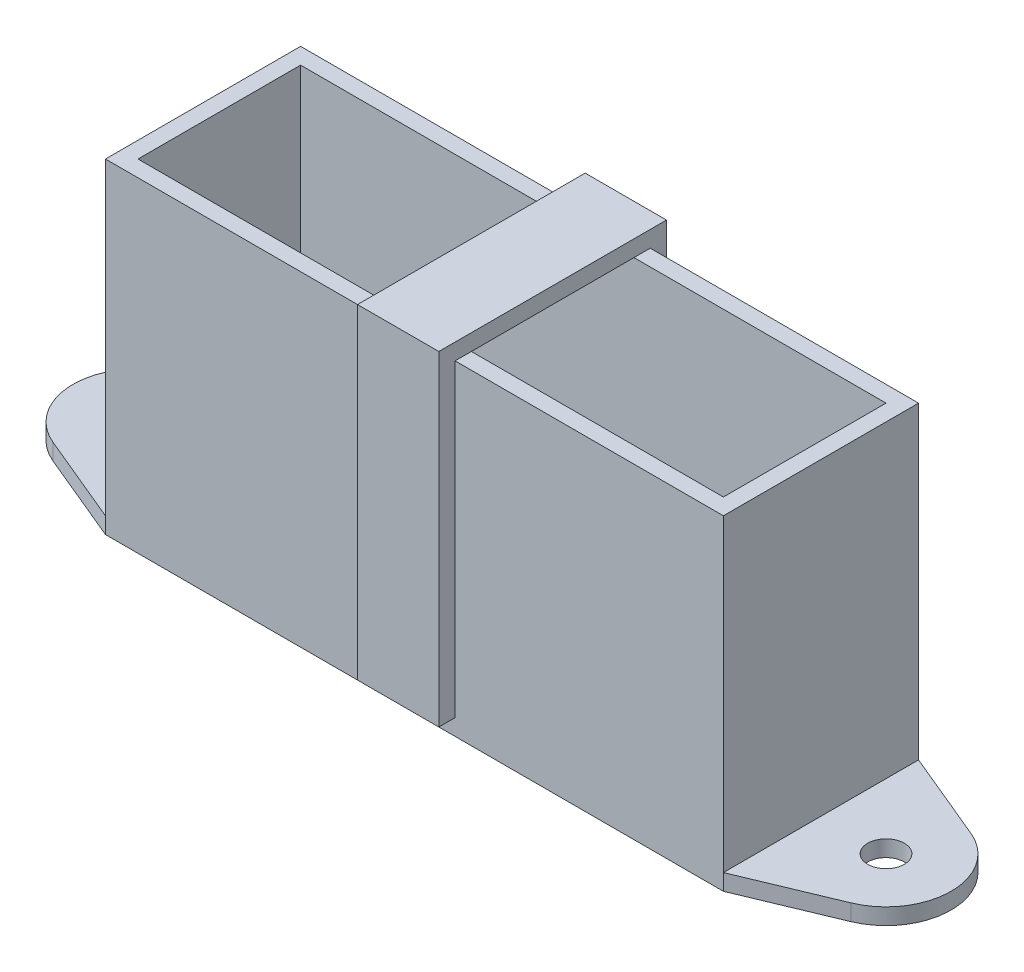
ISO-10303-21;
HEADER;
FILE_DESCRIPTION(('STEP AP214'),'2;1');
FILE_NAME('part.step','',(''),(''),'','','');
FILE_SCHEMA(('AUTOMOTIVE_DESIGN { 1 0 10303 214 1 1 1 1 }'));
ENDSEC;
DATA;
#1=APPLICATION_CONTEXT('core data for automotive mechanical design processes');
#2=APPLICATION_PROTOCOL_DEFINITION('international standard','automotive_design',2000,#1);
#3=PRODUCT_CONTEXT('',#1,'mechanical');
#4=PRODUCT('Part','Part','',(#3));
#5=PRODUCT_RELATED_PRODUCT_CATEGORY('part','',(#4));
#6=PRODUCT_DEFINITION_FORMATION('','',#4);
#7=PRODUCT_DEFINITION_CONTEXT('part definition',#1,'design');
#8=PRODUCT_DEFINITION('design','',#6,#7);
#9=PRODUCT_DEFINITION_SHAPE('','',#8);
#10=(LENGTH_UNIT() NAMED_UNIT(*) SI_UNIT(.MILLI.,.METRE.));
#11=(NAMED_UNIT(*) PLANE_ANGLE_UNIT() SI_UNIT($,.RADIAN.));
#12=(NAMED_UNIT(*) SI_UNIT($,.STERADIAN.) SOLID_ANGLE_UNIT());
#13=UNCERTAINTY_MEASURE_WITH_UNIT(LENGTH_MEASURE(1.E-05),#10,'distance_accuracy_value','');
#14=(GEOMETRIC_REPRESENTATION_CONTEXT(3) GLOBAL_UNCERTAINTY_ASSIGNED_CONTEXT((#13)) GLOBAL_UNIT_ASSIGNED_CONTEXT((#10,
#11,#12)) REPRESENTATION_CONTEXT('',''));
#15=CARTESIAN_POINT('',(0.,0.,0.));
#16=DIRECTION('',(0.,0.,1.));
#17=DIRECTION('',(1.,0.,0.));
#18=AXIS2_PLACEMENT_3D('',#15,#16,#17);
#19=CARTESIAN_POINT('',(-5.,40.,-12.));
#20=DIRECTION('',(1.,0.,0.));
#21=DIRECTION('',(0.,0.,-1.));
#22=AXIS2_PLACEMENT_3D('',#19,#20,#21);
#23=PLANE('',#22);
#24=DIRECTION('',(0.,0.,1.));
#25=VECTOR('',#24,1.);
#26=CARTESIAN_POINT('',(-5.,38.,-12.));
#27=LINE('',#26,#25);
#28=CARTESIAN_POINT('',(-5.,38.,-12.));
#29=VERTEX_POINT('',#28);
#30=CARTESIAN_POINT('',(-5.,38.,12.));
#31=VERTEX_POINT('',#30);
#32=EDGE_CURVE('E173',#29,#31,#27,.T.);
#33=ORIENTED_EDGE('',*,*,#32,.T.);
#34=DIRECTION('',(0.,-1.,0.));
#35=VECTOR('',#34,1.);
#36=CARTESIAN_POINT('',(-5.,40.,12.));
#37=LINE('',#36,#35);
#38=CARTESIAN_POINT('',(-5.,0.,12.));
#39=VERTEX_POINT('',#38);
#40=EDGE_CURVE('E154',#31,#39,#37,.T.);
#41=ORIENTED_EDGE('',*,*,#40,.T.);
#42=DIRECTION('',(0.,0.,-1.));
#43=VECTOR('',#42,1.);
#44=CARTESIAN_POINT('',(-5.,0.,14.));
#45=LINE('',#44,#43);
#46=CARTESIAN_POINT('',(-5.,0.,14.));
#47=VERTEX_POINT('',#46);
#48=EDGE_CURVE('E171',#47,#39,#45,.T.);
#49=ORIENTED_EDGE('',*,*,#48,.F.);
#50=DIRECTION('',(0.,-1.,0.));
#51=VECTOR('',#50,1.);
#52=CARTESIAN_POINT('',(-5.,40.,14.));
#53=LINE('',#52,#51);
#54=CARTESIAN_POINT('',(-5.,40.,14.));
#55=VERTEX_POINT('',#54);
#56=EDGE_CURVE('E121',#55,#47,#53,.T.);
#57=ORIENTED_EDGE('',*,*,#56,.F.);
#58=DIRECTION('',(0.,0.,1.));
#59=VECTOR('',#58,1.);
#60=CARTESIAN_POINT('',(-5.,40.,-12.));
#61=LINE('',#60,#59);
#62=CARTESIAN_POINT('',(-5.,40.,-14.));
#63=VERTEX_POINT('',#62);
#64=EDGE_CURVE('E57',#63,#55,#61,.T.);
#65=ORIENTED_EDGE('',*,*,#64,.F.);
#66=DIRECTION('',(0.,-1.,0.));
#67=VECTOR('',#66,1.);
#68=CARTESIAN_POINT('',(-5.,40.,-14.));
#69=LINE('',#68,#67);
#70=CARTESIAN_POINT('',(-5.,0.,-14.));
#71=VERTEX_POINT('',#70);
#72=EDGE_CURVE('E117',#63,#71,#69,.T.);
#73=ORIENTED_EDGE('',*,*,#72,.T.);
#74=DIRECTION('',(0.,0.,1.));
#75=VECTOR('',#74,1.);
#76=CARTESIAN_POINT('',(-5.,0.,-14.));
#77=LINE('',#76,#75);
#78=CARTESIAN_POINT('',(-5.,0.,-12.));
#79=VERTEX_POINT('',#78);
#80=EDGE_CURVE('E143',#71,#79,#77,.T.);
#81=ORIENTED_EDGE('',*,*,#80,.T.);
#82=DIRECTION('',(0.,-1.,0.));
#83=VECTOR('',#82,1.);
#84=CARTESIAN_POINT('',(-5.,40.,-12.));
#85=LINE('',#84,#83);
#86=EDGE_CURVE('E144',#29,#79,#85,.T.);
#87=ORIENTED_EDGE('',*,*,#86,.F.);
#88=EDGE_LOOP('',(#33,#41,#49,#57,#65,#73,#81,#87));
#89=FACE_BOUND('',#88,.T.);
#90=ADVANCED_FACE('F49',(#89),#23,.F.);
#91=CARTESIAN_POINT('',(5.,40.,-12.));
#92=DIRECTION('',(-1.,0.,0.));
#93=DIRECTION('',(0.,0.,1.));
#94=AXIS2_PLACEMENT_3D('',#91,#92,#93);
#95=PLANE('',#94);
#96=DIRECTION('',(0.,0.,-1.));
#97=VECTOR('',#96,1.);
#98=CARTESIAN_POINT('',(5.,38.,-12.));
#99=LINE('',#98,#97);
#100=CARTESIAN_POINT('',(5.,38.,12.));
#101=VERTEX_POINT('',#100);
#102=CARTESIAN_POINT('',(5.,38.,-12.));
#103=VERTEX_POINT('',#102);
#104=EDGE_CURVE('E65',#101,#103,#99,.T.);
#105=ORIENTED_EDGE('',*,*,#104,.T.);
#106=DIRECTION('',(0.,1.,0.));
#107=VECTOR('',#106,1.);
#108=CARTESIAN_POINT('',(5.,40.,-12.));
#109=LINE('',#108,#107);
#110=CARTESIAN_POINT('',(5.,0.,-12.));
#111=VERTEX_POINT('',#110);
#112=EDGE_CURVE('E146',#111,#103,#109,.T.);
#113=ORIENTED_EDGE('',*,*,#112,.F.);
#114=DIRECTION('',(0.,0.,1.));
#115=VECTOR('',#114,1.);
#116=CARTESIAN_POINT('',(5.,0.,-14.));
#117=LINE('',#116,#115);
#118=CARTESIAN_POINT('',(5.,0.,-14.));
#119=VERTEX_POINT('',#118);
#120=EDGE_CURVE('E152',#119,#111,#117,.T.);
#121=ORIENTED_EDGE('',*,*,#120,.F.);
#122=DIRECTION('',(0.,1.,0.));
#123=VECTOR('',#122,1.);
#124=CARTESIAN_POINT('',(5.,40.,-14.));
#125=LINE('',#124,#123);
#126=CARTESIAN_POINT('',(5.,40.,-14.));
#127=VERTEX_POINT('',#126);
#128=EDGE_CURVE('E138',#119,#127,#125,.T.);
#129=ORIENTED_EDGE('',*,*,#128,.T.);
#130=DIRECTION('',(0.,0.,-1.));
#131=VECTOR('',#130,1.);
#132=CARTESIAN_POINT('',(5.,40.,-12.));
#133=LINE('',#132,#131);
#134=CARTESIAN_POINT('',(5.,40.,14.));
#135=VERTEX_POINT('',#134);
#136=EDGE_CURVE('E12',#135,#127,#133,.T.);
#137=ORIENTED_EDGE('',*,*,#136,.F.);
#138=DIRECTION('',(0.,1.,0.));
#139=VECTOR('',#138,1.);
#140=CARTESIAN_POINT('',(5.,40.,14.));
#141=LINE('',#140,#139);
#142=CARTESIAN_POINT('',(5.,0.,14.));
#143=VERTEX_POINT('',#142);
#144=EDGE_CURVE('E159',#143,#135,#141,.T.);
#145=ORIENTED_EDGE('',*,*,#144,.F.);
#146=DIRECTION('',(0.,0.,-1.));
#147=VECTOR('',#146,1.);
#148=CARTESIAN_POINT('',(5.,0.,14.));
#149=LINE('',#148,#147);
#150=CARTESIAN_POINT('',(5.,0.,12.));
#151=VERTEX_POINT('',#150);
#152=EDGE_CURVE('E164',#143,#151,#149,.T.);
#153=ORIENTED_EDGE('',*,*,#152,.T.);
#154=DIRECTION('',(0.,1.,0.));
#155=VECTOR('',#154,1.);
#156=CARTESIAN_POINT('',(5.,40.,12.));
#157=LINE('',#156,#155);
#158=EDGE_CURVE('E157',#151,#101,#157,.T.);
#159=ORIENTED_EDGE('',*,*,#158,.T.);
#160=EDGE_LOOP('',(#105,#113,#121,#129,#137,#145,#153,#159));
#161=FACE_BOUND('',#160,.T.);
#162=ADVANCED_FACE('F184',(#161),#95,.F.);
#163=CARTESIAN_POINT('',(0.,40.,0.));
#164=DIRECTION('',(0.,1.,0.));
#165=DIRECTION('',(0.,0.,1.));
#166=AXIS2_PLACEMENT_3D('',#163,#164,#165);
#167=PLANE('',#166);
#168=ORIENTED_EDGE('',*,*,#64,.T.);
#169=DIRECTION('',(-1.,0.,0.));
#170=VECTOR('',#169,1.);
#171=CARTESIAN_POINT('',(-5.,40.,14.));
#172=LINE('',#171,#170);
#173=EDGE_CURVE('E162',#135,#55,#172,.T.);
#174=ORIENTED_EDGE('',*,*,#173,.F.);
#175=ORIENTED_EDGE('',*,*,#136,.T.);
#176=DIRECTION('',(-1.,0.,0.));
#177=VECTOR('',#176,1.);
#178=CARTESIAN_POINT('',(-5.,40.,-14.));
#179=LINE('',#178,#177);
#180=EDGE_CURVE('E131',#127,#63,#179,.T.);
#181=ORIENTED_EDGE('',*,*,#180,.T.);
#182=EDGE_LOOP('',(#168,#174,#175,#181));
#183=FACE_BOUND('',#182,.T.);
#184=ADVANCED_FACE('F137',(#183),#167,.T.);
#185=CARTESIAN_POINT('',(0.,38.,0.));
#186=DIRECTION('',(0.,1.,0.));
#187=DIRECTION('',(0.,0.,1.));
#188=AXIS2_PLACEMENT_3D('',#185,#186,#187);
#189=PLANE('',#188);
#190=ORIENTED_EDGE('',*,*,#32,.F.);
#191=DIRECTION('',(-1.,0.,0.));
#192=VECTOR('',#191,1.);
#193=CARTESIAN_POINT('',(-5.,38.,-12.));
#194=LINE('',#193,#192);
#195=EDGE_CURVE('E52',#103,#29,#194,.T.);
#196=ORIENTED_EDGE('',*,*,#195,.F.);
#197=ORIENTED_EDGE('',*,*,#104,.F.);
#198=DIRECTION('',(1.,0.,0.));
#199=VECTOR('',#198,1.);
#200=CARTESIAN_POINT('',(-5.,38.,12.));
#201=LINE('',#200,#199);
#202=EDGE_CURVE('E72',#31,#101,#201,.T.);
#203=ORIENTED_EDGE('',*,*,#202,.F.);
#204=EDGE_LOOP('',(#190,#196,#197,#203));
#205=FACE_BOUND('',#204,.T.);
#206=ADVANCED_FACE('F190',(#205),#189,.F.);
#207=CARTESIAN_POINT('',(0.,0.,12.));
#208=DIRECTION('',(0.,0.,1.));
#209=DIRECTION('',(1.,0.,0.));
#210=AXIS2_PLACEMENT_3D('',#207,#208,#209);
#211=PLANE('',#210);
#212=ORIENTED_EDGE('',*,*,#40,.F.);
#213=ORIENTED_EDGE('',*,*,#202,.T.);
#214=ORIENTED_EDGE('',*,*,#158,.F.);
#215=DIRECTION('',(1.,0.,0.));
#216=VECTOR('',#215,1.);
#217=CARTESIAN_POINT('',(-5.,0.,12.));
#218=LINE('',#217,#216);
#219=EDGE_CURVE('E166',#39,#151,#218,.T.);
#220=ORIENTED_EDGE('',*,*,#219,.F.);
#221=EDGE_LOOP('',(#212,#213,#214,#220));
#222=FACE_BOUND('',#221,.T.);
#223=ADVANCED_FACE('F194',(#222),#211,.F.);
#224=CARTESIAN_POINT('',(-5.,0.,14.));
#225=DIRECTION('',(0.,1.,0.));
#226=DIRECTION('',(0.,0.,1.));
#227=AXIS2_PLACEMENT_3D('',#224,#225,#226);
#228=PLANE('',#227);
#229=ORIENTED_EDGE('',*,*,#219,.T.);
#230=ORIENTED_EDGE('',*,*,#152,.F.);
#231=DIRECTION('',(1.,0.,0.));
#232=VECTOR('',#231,1.);
#233=CARTESIAN_POINT('',(-5.,0.,14.));
#234=LINE('',#233,#232);
#235=EDGE_CURVE('E156',#47,#143,#234,.T.);
#236=ORIENTED_EDGE('',*,*,#235,.F.);
#237=ORIENTED_EDGE('',*,*,#48,.T.);
#238=EDGE_LOOP('',(#229,#230,#236,#237));
#239=FACE_BOUND('',#238,.T.);
#240=ADVANCED_FACE('F196',(#239),#228,.F.);
#241=CARTESIAN_POINT('',(0.,0.,14.));
#242=DIRECTION('',(0.,0.,1.));
#243=DIRECTION('',(1.,0.,0.));
#244=AXIS2_PLACEMENT_3D('',#241,#242,#243);
#245=PLANE('',#244);
#246=ORIENTED_EDGE('',*,*,#56,.T.);
#247=ORIENTED_EDGE('',*,*,#235,.T.);
#248=ORIENTED_EDGE('',*,*,#144,.T.);
#249=ORIENTED_EDGE('',*,*,#173,.T.);
#250=EDGE_LOOP('',(#246,#247,#248,#249));
#251=FACE_BOUND('',#250,.T.);
#252=ADVANCED_FACE('F199',(#251),#245,.T.);
#253=CARTESIAN_POINT('',(0.,0.,-12.));
#254=DIRECTION('',(0.,0.,-1.));
#255=DIRECTION('',(1.,0.,0.));
#256=AXIS2_PLACEMENT_3D('',#253,#254,#255);
#257=PLANE('',#256);
#258=ORIENTED_EDGE('',*,*,#112,.T.);
#259=ORIENTED_EDGE('',*,*,#195,.T.);
#260=ORIENTED_EDGE('',*,*,#86,.T.);
#261=DIRECTION('',(1.,0.,0.));
#262=VECTOR('',#261,1.);
#263=CARTESIAN_POINT('',(-5.,0.,-12.));
#264=LINE('',#263,#262);
#265=EDGE_CURVE('E135',#79,#111,#264,.T.);
#266=ORIENTED_EDGE('',*,*,#265,.T.);
#267=EDGE_LOOP('',(#258,#259,#260,#266));
#268=FACE_BOUND('',#267,.T.);
#269=ADVANCED_FACE('F179',(#268),#257,.F.);
#270=CARTESIAN_POINT('',(-5.,0.,-14.));
#271=DIRECTION('',(0.,-1.,0.));
#272=DIRECTION('',(0.,0.,-1.));
#273=AXIS2_PLACEMENT_3D('',#270,#271,#272);
#274=PLANE('',#273);
#275=ORIENTED_EDGE('',*,*,#265,.F.);
#276=ORIENTED_EDGE('',*,*,#80,.F.);
#277=DIRECTION('',(1.,0.,0.));
#278=VECTOR('',#277,1.);
#279=CARTESIAN_POINT('',(-5.,0.,-14.));
#280=LINE('',#279,#278);
#281=EDGE_CURVE('E134',#71,#119,#280,.T.);
#282=ORIENTED_EDGE('',*,*,#281,.T.);
#283=ORIENTED_EDGE('',*,*,#120,.T.);
#284=EDGE_LOOP('',(#275,#276,#282,#283));
#285=FACE_BOUND('',#284,.T.);
#286=ADVANCED_FACE('F183',(#285),#274,.T.);
#287=CARTESIAN_POINT('',(0.,0.,-14.));
#288=DIRECTION('',(0.,0.,-1.));
#289=DIRECTION('',(1.,0.,0.));
#290=AXIS2_PLACEMENT_3D('',#287,#288,#289);
#291=PLANE('',#290);
#292=ORIENTED_EDGE('',*,*,#72,.F.);
#293=ORIENTED_EDGE('',*,*,#180,.F.);
#294=ORIENTED_EDGE('',*,*,#128,.F.);
#295=ORIENTED_EDGE('',*,*,#281,.F.);
#296=EDGE_LOOP('',(#292,#293,#294,#295));
#297=FACE_BOUND('',#296,.T.);
#298=ADVANCED_FACE('F129',(#297),#291,.T.);
#299=CLOSED_SHELL('',(#90,#162,#184,#206,#223,#240,#252,#269,#286,#298));
#300=MANIFOLD_SOLID_BREP('B2',#299);
#301=CARTESIAN_POINT('',(0.,38.,0.));
#302=DIRECTION('',(0.,1.,0.));
#303=DIRECTION('',(0.,0.,1.));
#304=AXIS2_PLACEMENT_3D('',#301,#302,#303);
#305=PLANE('',#304);
#306=DIRECTION('',(1.,0.,0.));
#307=VECTOR('',#306,1.);
#308=CARTESIAN_POINT('',(-38.,38.,12.));
#309=LINE('',#308,#307);
#310=CARTESIAN_POINT('',(-38.,38.,12.));
#311=VERTEX_POINT('',#310);
#312=CARTESIAN_POINT('',(38.,38.,12.));
#313=VERTEX_POINT('',#312);
#314=EDGE_CURVE('E383',#311,#313,#309,.T.);
#315=ORIENTED_EDGE('',*,*,#314,.T.);
#316=DIRECTION('',(0.,0.,-1.));
#317=VECTOR('',#316,1.);
#318=CARTESIAN_POINT('',(38.,38.,12.));
#319=LINE('',#318,#317);
#320=CARTESIAN_POINT('',(38.,38.,-12.));
#321=VERTEX_POINT('',#320);
#322=EDGE_CURVE('E376',#313,#321,#319,.T.);
#323=ORIENTED_EDGE('',*,*,#322,.T.);
#324=DIRECTION('',(-1.,0.,0.));
#325=VECTOR('',#324,1.);
#326=CARTESIAN_POINT('',(-38.,38.,-12.));
#327=LINE('',#326,#325);
#328=CARTESIAN_POINT('',(-38.,38.,-12.));
#329=VERTEX_POINT('',#328);
#330=EDGE_CURVE('E380',#321,#329,#327,.T.);
#331=ORIENTED_EDGE('',*,*,#330,.T.);
#332=DIRECTION('',(0.,0.,1.));
#333=VECTOR('',#332,1.);
#334=CARTESIAN_POINT('',(-38.,38.,12.));
#335=LINE('',#334,#333);
#336=EDGE_CURVE('E339',#329,#311,#335,.T.);
#337=ORIENTED_EDGE('',*,*,#336,.T.);
#338=EDGE_LOOP('',(#315,#323,#331,#337));
#339=FACE_BOUND('',#338,.T.);
#340=DIRECTION('',(-1.,0.,0.));
#341=VECTOR('',#340,1.);
#342=CARTESIAN_POINT('',(-36.,38.,-10.));
#343=LINE('',#342,#341);
#344=CARTESIAN_POINT('',(36.,38.,-10.));
#345=VERTEX_POINT('',#344);
#346=CARTESIAN_POINT('',(-36.,38.,-10.));
#347=VERTEX_POINT('',#346);
#348=EDGE_CURVE('E447',#345,#347,#343,.T.);
#349=ORIENTED_EDGE('',*,*,#348,.F.);
#350=DIRECTION('',(0.,0.,-1.));
#351=VECTOR('',#350,1.);
#352=CARTESIAN_POINT('',(36.,38.,10.));
#353=LINE('',#352,#351);
#354=CARTESIAN_POINT('',(36.,38.,10.));
#355=VERTEX_POINT('',#354);
#356=EDGE_CURVE('E440',#355,#345,#353,.T.);
#357=ORIENTED_EDGE('',*,*,#356,.F.);
#358=DIRECTION('',(1.,0.,0.));
#359=VECTOR('',#358,1.);
#360=CARTESIAN_POINT('',(-36.,38.,10.));
#361=LINE('',#360,#359);
#362=CARTESIAN_POINT('',(-36.,38.,10.));
#363=VERTEX_POINT('',#362);
#364=EDGE_CURVE('E360',#363,#355,#361,.T.);
#365=ORIENTED_EDGE('',*,*,#364,.F.);
#366=DIRECTION('',(0.,0.,1.));
#367=VECTOR('',#366,1.);
#368=CARTESIAN_POINT('',(-36.,38.,10.));
#369=LINE('',#368,#367);
#370=EDGE_CURVE('E458',#347,#363,#369,.T.);
#371=ORIENTED_EDGE('',*,*,#370,.F.);
#372=EDGE_LOOP('',(#349,#357,#365,#371));
#373=FACE_BOUND('',#372,.T.);
#374=ADVANCED_FACE('F315',(#339,#373),#305,.T.);
#375=CARTESIAN_POINT('',(-38.,38.,12.));
#376=DIRECTION('',(0.,0.,-1.));
#377=DIRECTION('',(-1.,0.,0.));
#378=AXIS2_PLACEMENT_3D('',#375,#376,#377);
#379=PLANE('',#378);
#380=DIRECTION('',(0.,-1.,0.));
#381=VECTOR('',#380,1.);
#382=CARTESIAN_POINT('',(-38.,38.,12.));
#383=LINE('',#382,#381);
#384=CARTESIAN_POINT('',(-38.,0.,12.));
#385=VERTEX_POINT('',#384);
#386=EDGE_CURVE('E398',#311,#385,#383,.T.);
#387=ORIENTED_EDGE('',*,*,#386,.T.);
#388=DIRECTION('',(0.,1.,0.));
#389=VECTOR('',#388,1.);
#390=CARTESIAN_POINT('',(-38.,-2.,12.));
#391=LINE('',#390,#389);
#392=CARTESIAN_POINT('',(-38.,-2.,12.));
#393=VERTEX_POINT('',#392);
#394=EDGE_CURVE('E758',#393,#385,#391,.T.);
#395=ORIENTED_EDGE('',*,*,#394,.F.);
#396=DIRECTION('',(-1.,0.,0.));
#397=VECTOR('',#396,1.);
#398=CARTESIAN_POINT('',(-38.,-2.,12.));
#399=LINE('',#398,#397);
#400=CARTESIAN_POINT('',(38.,-2.,12.));
#401=VERTEX_POINT('',#400);
#402=EDGE_CURVE('E755',#401,#393,#399,.T.);
#403=ORIENTED_EDGE('',*,*,#402,.F.);
#404=DIRECTION('',(0.,1.,0.));
#405=VECTOR('',#404,1.);
#406=CARTESIAN_POINT('',(38.,-2.,12.));
#407=LINE('',#406,#405);
#408=CARTESIAN_POINT('',(38.,0.,12.));
#409=VERTEX_POINT('',#408);
#410=EDGE_CURVE('E771',#401,#409,#407,.T.);
#411=ORIENTED_EDGE('',*,*,#410,.T.);
#412=DIRECTION('',(0.,-1.,0.));
#413=VECTOR('',#412,1.);
#414=CARTESIAN_POINT('',(38.,38.,12.));
#415=LINE('',#414,#413);
#416=EDGE_CURVE('E47',#313,#409,#415,.T.);
#417=ORIENTED_EDGE('',*,*,#416,.F.);
#418=ORIENTED_EDGE('',*,*,#314,.F.);
#419=EDGE_LOOP('',(#387,#395,#403,#411,#417,#418));
#420=FACE_BOUND('',#419,.T.);
#421=ADVANCED_FACE('F317',(#420),#379,.F.);
#422=CARTESIAN_POINT('',(38.,38.,12.));
#423=DIRECTION('',(-1.,0.,0.));
#424=DIRECTION('',(0.,0.,1.));
#425=AXIS2_PLACEMENT_3D('',#422,#423,#424);
#426=PLANE('',#425);
#427=DIRECTION('',(0.,0.,-1.));
#428=VECTOR('',#427,1.);
#429=CARTESIAN_POINT('',(38.,0.,12.));
#430=LINE('',#429,#428);
#431=CARTESIAN_POINT('',(38.,0.,-12.));
#432=VERTEX_POINT('',#431);
#433=EDGE_CURVE('E390',#409,#432,#430,.T.);
#434=ORIENTED_EDGE('',*,*,#433,.T.);
#435=DIRECTION('',(0.,-1.,0.));
#436=VECTOR('',#435,1.);
#437=CARTESIAN_POINT('',(38.,38.,-12.));
#438=LINE('',#437,#436);
#439=EDGE_CURVE('E323',#321,#432,#438,.T.);
#440=ORIENTED_EDGE('',*,*,#439,.F.);
#441=ORIENTED_EDGE('',*,*,#322,.F.);
#442=ORIENTED_EDGE('',*,*,#416,.T.);
#443=EDGE_LOOP('',(#434,#440,#441,#442));
#444=FACE_BOUND('',#443,.T.);
#445=ADVANCED_FACE('F389',(#444),#426,.F.);
#446=CARTESIAN_POINT('',(-38.,38.,-12.));
#447=DIRECTION('',(0.,0.,1.));
#448=DIRECTION('',(1.,0.,0.));
#449=AXIS2_PLACEMENT_3D('',#446,#447,#448);
#450=PLANE('',#449);
#451=ORIENTED_EDGE('',*,*,#439,.T.);
#452=DIRECTION('',(0.,1.,0.));
#453=VECTOR('',#452,1.);
#454=CARTESIAN_POINT('',(38.,-2.,-12.));
#455=LINE('',#454,#453);
#456=CARTESIAN_POINT('',(38.,-2.,-12.));
#457=VERTEX_POINT('',#456);
#458=EDGE_CURVE('E780',#457,#432,#455,.T.);
#459=ORIENTED_EDGE('',*,*,#458,.F.);
#460=DIRECTION('',(1.,0.,0.));
#461=VECTOR('',#460,1.);
#462=CARTESIAN_POINT('',(38.,-2.,-12.));
#463=LINE('',#462,#461);
#464=CARTESIAN_POINT('',(-38.,-2.,-12.));
#465=VERTEX_POINT('',#464);
#466=EDGE_CURVE('E743',#465,#457,#463,.T.);
#467=ORIENTED_EDGE('',*,*,#466,.F.);
#468=DIRECTION('',(0.,1.,0.));
#469=VECTOR('',#468,1.);
#470=CARTESIAN_POINT('',(-38.,-2.,-12.));
#471=LINE('',#470,#469);
#472=CARTESIAN_POINT('',(-38.,0.,-12.));
#473=VERTEX_POINT('',#472);
#474=EDGE_CURVE('E782',#465,#473,#471,.T.);
#475=ORIENTED_EDGE('',*,*,#474,.T.);
#476=DIRECTION('',(0.,-1.,0.));
#477=VECTOR('',#476,1.);
#478=CARTESIAN_POINT('',(-38.,38.,-12.));
#479=LINE('',#478,#477);
#480=EDGE_CURVE('E393',#329,#473,#479,.T.);
#481=ORIENTED_EDGE('',*,*,#480,.F.);
#482=ORIENTED_EDGE('',*,*,#330,.F.);
#483=EDGE_LOOP('',(#451,#459,#467,#475,#481,#482));
#484=FACE_BOUND('',#483,.T.);
#485=ADVANCED_FACE('F394',(#484),#450,.F.);
#486=CARTESIAN_POINT('',(-38.,38.,12.));
#487=DIRECTION('',(1.,0.,0.));
#488=DIRECTION('',(0.,0.,-1.));
#489=AXIS2_PLACEMENT_3D('',#486,#487,#488);
#490=PLANE('',#489);
#491=DIRECTION('',(0.,0.,1.));
#492=VECTOR('',#491,1.);
#493=CARTESIAN_POINT('',(-38.,0.,12.));
#494=LINE('',#493,#492);
#495=EDGE_CURVE('E403',#473,#385,#494,.T.);
#496=ORIENTED_EDGE('',*,*,#495,.T.);
#497=ORIENTED_EDGE('',*,*,#386,.F.);
#498=ORIENTED_EDGE('',*,*,#336,.F.);
#499=ORIENTED_EDGE('',*,*,#480,.T.);
#500=EDGE_LOOP('',(#496,#497,#498,#499));
#501=FACE_BOUND('',#500,.T.);
#502=ADVANCED_FACE('F411',(#501),#490,.F.);
#503=CARTESIAN_POINT('',(36.,38.,10.));
#504=DIRECTION('',(-1.,0.,0.));
#505=DIRECTION('',(0.,0.,1.));
#506=AXIS2_PLACEMENT_3D('',#503,#504,#505);
#507=PLANE('',#506);
#508=DIRECTION('',(0.,0.,-1.));
#509=VECTOR('',#508,1.);
#510=CARTESIAN_POINT('',(36.,0.,10.));
#511=LINE('',#510,#509);
#512=CARTESIAN_POINT('',(36.,0.,10.));
#513=VERTEX_POINT('',#512);
#514=CARTESIAN_POINT('',(36.,0.,-10.));
#515=VERTEX_POINT('',#514);
#516=EDGE_CURVE('E464',#513,#515,#511,.T.);
#517=ORIENTED_EDGE('',*,*,#516,.F.);
#518=DIRECTION('',(0.,-1.,0.));
#519=VECTOR('',#518,1.);
#520=CARTESIAN_POINT('',(36.,38.,10.));
#521=LINE('',#520,#519);
#522=EDGE_CURVE('E445',#355,#513,#521,.T.);
#523=ORIENTED_EDGE('',*,*,#522,.F.);
#524=ORIENTED_EDGE('',*,*,#356,.T.);
#525=DIRECTION('',(0.,-1.,0.));
#526=VECTOR('',#525,1.);
#527=CARTESIAN_POINT('',(36.,38.,-10.));
#528=LINE('',#527,#526);
#529=EDGE_CURVE('E404',#345,#515,#528,.T.);
#530=ORIENTED_EDGE('',*,*,#529,.T.);
#531=EDGE_LOOP('',(#517,#523,#524,#530));
#532=FACE_BOUND('',#531,.T.);
#533=ADVANCED_FACE('F443',(#532),#507,.T.);
#534=CARTESIAN_POINT('',(-36.,38.,-10.));
#535=DIRECTION('',(0.,0.,1.));
#536=DIRECTION('',(1.,0.,0.));
#537=AXIS2_PLACEMENT_3D('',#534,#535,#536);
#538=PLANE('',#537);
#539=DIRECTION('',(-1.,0.,0.));
#540=VECTOR('',#539,1.);
#541=CARTESIAN_POINT('',(-36.,0.,-10.));
#542=LINE('',#541,#540);
#543=CARTESIAN_POINT('',(-36.,0.,-10.));
#544=VERTEX_POINT('',#543);
#545=EDGE_CURVE('E454',#515,#544,#542,.T.);
#546=ORIENTED_EDGE('',*,*,#545,.F.);
#547=ORIENTED_EDGE('',*,*,#529,.F.);
#548=ORIENTED_EDGE('',*,*,#348,.T.);
#549=DIRECTION('',(0.,-1.,0.));
#550=VECTOR('',#549,1.);
#551=CARTESIAN_POINT('',(-36.,38.,-10.));
#552=LINE('',#551,#550);
#553=EDGE_CURVE('E455',#347,#544,#552,.T.);
#554=ORIENTED_EDGE('',*,*,#553,.T.);
#555=EDGE_LOOP('',(#546,#547,#548,#554));
#556=FACE_BOUND('',#555,.T.);
#557=ADVANCED_FACE('F451',(#556),#538,.T.);
#558=CARTESIAN_POINT('',(-36.,38.,10.));
#559=DIRECTION('',(1.,0.,0.));
#560=DIRECTION('',(0.,0.,-1.));
#561=AXIS2_PLACEMENT_3D('',#558,#559,#560);
#562=PLANE('',#561);
#563=DIRECTION('',(0.,0.,1.));
#564=VECTOR('',#563,1.);
#565=CARTESIAN_POINT('',(-36.,0.,10.));
#566=LINE('',#565,#564);
#567=CARTESIAN_POINT('',(-36.,0.,10.));
#568=VERTEX_POINT('',#567);
#569=EDGE_CURVE('E468',#544,#568,#566,.T.);
#570=ORIENTED_EDGE('',*,*,#569,.F.);
#571=ORIENTED_EDGE('',*,*,#553,.F.);
#572=ORIENTED_EDGE('',*,*,#370,.T.);
#573=DIRECTION('',(0.,-1.,0.));
#574=VECTOR('',#573,1.);
#575=CARTESIAN_POINT('',(-36.,38.,10.));
#576=LINE('',#575,#574);
#577=EDGE_CURVE('E330',#363,#568,#576,.T.);
#578=ORIENTED_EDGE('',*,*,#577,.T.);
#579=EDGE_LOOP('',(#570,#571,#572,#578));
#580=FACE_BOUND('',#579,.T.);
#581=ADVANCED_FACE('F477',(#580),#562,.T.);
#582=CARTESIAN_POINT('',(-36.,38.,10.));
#583=DIRECTION('',(0.,0.,-1.));
#584=DIRECTION('',(-1.,0.,0.));
#585=AXIS2_PLACEMENT_3D('',#582,#583,#584);
#586=PLANE('',#585);
#587=DIRECTION('',(1.,0.,0.));
#588=VECTOR('',#587,1.);
#589=CARTESIAN_POINT('',(-36.,0.,10.));
#590=LINE('',#589,#588);
#591=EDGE_CURVE('E448',#568,#513,#590,.T.);
#592=ORIENTED_EDGE('',*,*,#591,.F.);
#593=ORIENTED_EDGE('',*,*,#577,.F.);
#594=ORIENTED_EDGE('',*,*,#364,.T.);
#595=ORIENTED_EDGE('',*,*,#522,.T.);
#596=EDGE_LOOP('',(#592,#593,#594,#595));
#597=FACE_BOUND('',#596,.T.);
#598=ADVANCED_FACE('F480',(#597),#586,.T.);
#599=CARTESIAN_POINT('',(46.,0.,0.));
#600=DIRECTION('',(0.,1.,0.));
#601=DIRECTION('',(0.,0.,1.));
#602=AXIS2_PLACEMENT_3D('',#599,#600,#601);
#603=PLANE('',#602);
#604=ORIENTED_EDGE('',*,*,#591,.T.);
#605=ORIENTED_EDGE('',*,*,#516,.T.);
#606=ORIENTED_EDGE('',*,*,#545,.T.);
#607=ORIENTED_EDGE('',*,*,#569,.T.);
#608=EDGE_LOOP('',(#604,#605,#606,#607));
#609=FACE_BOUND('',#608,.T.);
#610=ADVANCED_FACE('F479',(#609),#603,.T.);
#611=CARTESIAN_POINT('',(-46.,0.,0.));
#612=DIRECTION('',(0.,1.,0.));
#613=DIRECTION('',(0.,0.,1.));
#614=AXIS2_PLACEMENT_3D('',#611,#612,#613);
#615=CIRCLE('',#614,2.25);
#616=CARTESIAN_POINT('',(-46.,0.,2.25));
#617=VERTEX_POINT('',#616);
#618=EDGE_CURVE('E722',#617,#617,#615,.T.);
#619=ORIENTED_EDGE('',*,*,#618,.F.);
#620=EDGE_LOOP('',(#619));
#621=FACE_BOUND('',#620,.T.);
#622=ORIENTED_EDGE('',*,*,#495,.F.);
#623=DIRECTION('',(0.923076923076923,0.,-0.384615384615385));
#624=VECTOR('',#623,1.);
#625=CARTESIAN_POINT('',(-38.,0.,-12.));
#626=LINE('',#625,#624);
#627=CARTESIAN_POINT('',(-49.0769230769231,0.,-7.38461538461538));
#628=VERTEX_POINT('',#627);
#629=EDGE_CURVE('E763',#628,#473,#626,.T.);
#630=ORIENTED_EDGE('',*,*,#629,.F.);
#631=CARTESIAN_POINT('',(-46.,0.,0.));
#632=DIRECTION('',(0.,-1.,0.));
#633=DIRECTION('',(0.,0.,1.));
#634=AXIS2_PLACEMENT_3D('',#631,#632,#633);
#635=CIRCLE('',#634,8.);
#636=CARTESIAN_POINT('',(-49.0769230769231,0.,7.38461538461539));
#637=VERTEX_POINT('',#636);
#638=EDGE_CURVE('E761',#637,#628,#635,.T.);
#639=ORIENTED_EDGE('',*,*,#638,.F.);
#640=DIRECTION('',(-0.923076923076923,0.,-0.384615384615384));
#641=VECTOR('',#640,1.);
#642=CARTESIAN_POINT('',(-49.0769230769231,0.,7.38461538461539));
#643=LINE('',#642,#641);
#644=EDGE_CURVE('E732',#385,#637,#643,.T.);
#645=ORIENTED_EDGE('',*,*,#644,.F.);
#646=EDGE_LOOP('',(#622,#630,#639,#645));
#647=FACE_BOUND('',#646,.T.);
#648=ADVANCED_FACE('F487',(#621,#647),#603,.T.);
#649=CARTESIAN_POINT('',(46.,0.,0.));
#650=DIRECTION('',(0.,1.,0.));
#651=DIRECTION('',(0.,0.,1.));
#652=AXIS2_PLACEMENT_3D('',#649,#650,#651);
#653=CIRCLE('',#652,2.25);
#654=CARTESIAN_POINT('',(46.,0.,2.25));
#655=VERTEX_POINT('',#654);
#656=EDGE_CURVE('E724',#655,#655,#653,.T.);
#657=ORIENTED_EDGE('',*,*,#656,.F.);
#658=EDGE_LOOP('',(#657));
#659=FACE_BOUND('',#658,.T.);
#660=ORIENTED_EDGE('',*,*,#433,.F.);
#661=DIRECTION('',(-0.923076923076923,0.,0.384615384615384));
#662=VECTOR('',#661,1.);
#663=CARTESIAN_POINT('',(38.,0.,12.));
#664=LINE('',#663,#662);
#665=CARTESIAN_POINT('',(49.0769230769231,0.,7.38461538461539));
#666=VERTEX_POINT('',#665);
#667=EDGE_CURVE('E737',#666,#409,#664,.T.);
#668=ORIENTED_EDGE('',*,*,#667,.F.);
#669=CARTESIAN_POINT('',(46.,0.,0.));
#670=DIRECTION('',(0.,-1.,0.));
#671=DIRECTION('',(0.,0.,1.));
#672=AXIS2_PLACEMENT_3D('',#669,#670,#671);
#673=CIRCLE('',#672,8.);
#674=CARTESIAN_POINT('',(49.0769230769231,0.,-7.38461538461539));
#675=VERTEX_POINT('',#674);
#676=EDGE_CURVE('E766',#675,#666,#673,.T.);
#677=ORIENTED_EDGE('',*,*,#676,.F.);
#678=DIRECTION('',(0.923076923076923,0.,0.384615384615385));
#679=VECTOR('',#678,1.);
#680=CARTESIAN_POINT('',(49.0769230769231,0.,-7.38461538461538));
#681=LINE('',#680,#679);
#682=EDGE_CURVE('E352',#432,#675,#681,.T.);
#683=ORIENTED_EDGE('',*,*,#682,.F.);
#684=EDGE_LOOP('',(#660,#668,#677,#683));
#685=FACE_BOUND('',#684,.T.);
#686=ADVANCED_FACE('F489',(#659,#685),#603,.T.);
#687=CARTESIAN_POINT('',(-49.0769230769231,-2.,7.38461538461539));
#688=DIRECTION('',(0.384615384615384,0.,-0.923076923076923));
#689=DIRECTION('',(-0.923076923076923,0.,-0.384615384615384));
#690=AXIS2_PLACEMENT_3D('',#687,#688,#689);
#691=PLANE('',#690);
#692=ORIENTED_EDGE('',*,*,#644,.T.);
#693=DIRECTION('',(0.,1.,0.));
#694=VECTOR('',#693,1.);
#695=CARTESIAN_POINT('',(-49.0769230769231,-2.,7.38461538461539));
#696=LINE('',#695,#694);
#697=CARTESIAN_POINT('',(-49.0769230769231,-2.,7.38461538461539));
#698=VERTEX_POINT('',#697);
#699=EDGE_CURVE('E466',#698,#637,#696,.T.);
#700=ORIENTED_EDGE('',*,*,#699,.F.);
#701=DIRECTION('',(-0.923076923076923,0.,-0.384615384615384));
#702=VECTOR('',#701,1.);
#703=CARTESIAN_POINT('',(-49.0769230769231,-2.,7.38461538461539));
#704=LINE('',#703,#702);
#705=EDGE_CURVE('E733',#393,#698,#704,.T.);
#706=ORIENTED_EDGE('',*,*,#705,.F.);
#707=ORIENTED_EDGE('',*,*,#394,.T.);
#708=EDGE_LOOP('',(#692,#700,#706,#707));
#709=FACE_BOUND('',#708,.T.);
#710=ADVANCED_FACE('F552',(#709),#691,.F.);
#711=CARTESIAN_POINT('',(-46.,-2.,0.));
#712=DIRECTION('',(0.,1.,0.));
#713=DIRECTION('',(0.,0.,1.));
#714=AXIS2_PLACEMENT_3D('',#711,#712,#713);
#715=CYLINDRICAL_SURFACE('',#714,8.);
#716=ORIENTED_EDGE('',*,*,#638,.T.);
#717=DIRECTION('',(0.,1.,0.));
#718=VECTOR('',#717,1.);
#719=CARTESIAN_POINT('',(-49.0769230769231,-2.,-7.38461538461538));
#720=LINE('',#719,#718);
#721=CARTESIAN_POINT('',(-49.0769230769231,-2.,-7.38461538461538));
#722=VERTEX_POINT('',#721);
#723=EDGE_CURVE('E784',#722,#628,#720,.T.);
#724=ORIENTED_EDGE('',*,*,#723,.F.);
#725=CARTESIAN_POINT('',(-46.,-2.,0.));
#726=DIRECTION('',(0.,-1.,0.));
#727=DIRECTION('',(0.,0.,1.));
#728=AXIS2_PLACEMENT_3D('',#725,#726,#727);
#729=CIRCLE('',#728,8.);
#730=EDGE_CURVE('E736',#698,#722,#729,.T.);
#731=ORIENTED_EDGE('',*,*,#730,.F.);
#732=ORIENTED_EDGE('',*,*,#699,.T.);
#733=EDGE_LOOP('',(#716,#724,#731,#732));
#734=FACE_BOUND('',#733,.T.);
#735=ADVANCED_FACE('F557',(#734),#715,.T.);
#736=CARTESIAN_POINT('',(-38.,-2.,-12.));
#737=DIRECTION('',(0.384615384615385,0.,0.923076923076923));
#738=DIRECTION('',(0.923076923076923,0.,-0.384615384615385));
#739=AXIS2_PLACEMENT_3D('',#736,#737,#738);
#740=PLANE('',#739);
#741=ORIENTED_EDGE('',*,*,#629,.T.);
#742=ORIENTED_EDGE('',*,*,#474,.F.);
#743=DIRECTION('',(0.923076923076923,0.,-0.384615384615385));
#744=VECTOR('',#743,1.);
#745=CARTESIAN_POINT('',(-38.,-2.,-12.));
#746=LINE('',#745,#744);
#747=EDGE_CURVE('E740',#722,#465,#746,.T.);
#748=ORIENTED_EDGE('',*,*,#747,.F.);
#749=ORIENTED_EDGE('',*,*,#723,.T.);
#750=EDGE_LOOP('',(#741,#742,#748,#749));
#751=FACE_BOUND('',#750,.T.);
#752=ADVANCED_FACE('F569',(#751),#740,.F.);
#753=CARTESIAN_POINT('',(49.0769230769231,-2.,-7.38461538461538));
#754=DIRECTION('',(-0.384615384615385,0.,0.923076923076923));
#755=DIRECTION('',(0.923076923076923,0.,0.384615384615385));
#756=AXIS2_PLACEMENT_3D('',#753,#754,#755);
#757=PLANE('',#756);
#758=ORIENTED_EDGE('',*,*,#682,.T.);
#759=DIRECTION('',(0.,1.,0.));
#760=VECTOR('',#759,1.);
#761=CARTESIAN_POINT('',(49.0769230769231,-2.,-7.38461538461539));
#762=LINE('',#761,#760);
#763=CARTESIAN_POINT('',(49.0769230769231,-2.,-7.38461538461539));
#764=VERTEX_POINT('',#763);
#765=EDGE_CURVE('E777',#764,#675,#762,.T.);
#766=ORIENTED_EDGE('',*,*,#765,.F.);
#767=DIRECTION('',(0.923076923076923,0.,0.384615384615385));
#768=VECTOR('',#767,1.);
#769=CARTESIAN_POINT('',(49.0769230769231,-2.,-7.38461538461538));
#770=LINE('',#769,#768);
#771=EDGE_CURVE('E746',#457,#764,#770,.T.);
#772=ORIENTED_EDGE('',*,*,#771,.F.);
#773=ORIENTED_EDGE('',*,*,#458,.T.);
#774=EDGE_LOOP('',(#758,#766,#772,#773));
#775=FACE_BOUND('',#774,.T.);
#776=ADVANCED_FACE('F580',(#775),#757,.F.);
#777=CARTESIAN_POINT('',(46.,-2.,0.));
#778=DIRECTION('',(0.,1.,0.));
#779=DIRECTION('',(0.,0.,1.));
#780=AXIS2_PLACEMENT_3D('',#777,#778,#779);
#781=CYLINDRICAL_SURFACE('',#780,8.);
#782=ORIENTED_EDGE('',*,*,#676,.T.);
#783=DIRECTION('',(0.,1.,0.));
#784=VECTOR('',#783,1.);
#785=CARTESIAN_POINT('',(49.0769230769231,-2.,7.38461538461539));
#786=LINE('',#785,#784);
#787=CARTESIAN_POINT('',(49.0769230769231,-2.,7.38461538461539));
#788=VERTEX_POINT('',#787);
#789=EDGE_CURVE('E774',#788,#666,#786,.T.);
#790=ORIENTED_EDGE('',*,*,#789,.F.);
#791=CARTESIAN_POINT('',(46.,-2.,0.));
#792=DIRECTION('',(0.,-1.,0.));
#793=DIRECTION('',(0.,0.,1.));
#794=AXIS2_PLACEMENT_3D('',#791,#792,#793);
#795=CIRCLE('',#794,8.);
#796=EDGE_CURVE('E749',#764,#788,#795,.T.);
#797=ORIENTED_EDGE('',*,*,#796,.F.);
#798=ORIENTED_EDGE('',*,*,#765,.T.);
#799=EDGE_LOOP('',(#782,#790,#797,#798));
#800=FACE_BOUND('',#799,.T.);
#801=ADVANCED_FACE('F591',(#800),#781,.T.);
#802=CARTESIAN_POINT('',(38.,-2.,12.));
#803=DIRECTION('',(-0.384615384615384,0.,-0.923076923076923));
#804=DIRECTION('',(-0.923076923076924,0.,0.384615384615384));
#805=AXIS2_PLACEMENT_3D('',#802,#803,#804);
#806=PLANE('',#805);
#807=ORIENTED_EDGE('',*,*,#667,.T.);
#808=ORIENTED_EDGE('',*,*,#410,.F.);
#809=DIRECTION('',(-0.923076923076923,0.,0.384615384615384));
#810=VECTOR('',#809,1.);
#811=CARTESIAN_POINT('',(38.,-2.,12.));
#812=LINE('',#811,#810);
#813=EDGE_CURVE('E752',#788,#401,#812,.T.);
#814=ORIENTED_EDGE('',*,*,#813,.F.);
#815=ORIENTED_EDGE('',*,*,#789,.T.);
#816=EDGE_LOOP('',(#807,#808,#814,#815));
#817=FACE_BOUND('',#816,.T.);
#818=ADVANCED_FACE('F602',(#817),#806,.F.);
#819=CARTESIAN_POINT('',(46.,-2.,0.));
#820=DIRECTION('',(0.,1.,0.));
#821=DIRECTION('',(0.,0.,1.));
#822=AXIS2_PLACEMENT_3D('',#819,#820,#821);
#823=PLANE('',#822);
#824=CARTESIAN_POINT('',(-46.,-2.,0.));
#825=DIRECTION('',(0.,1.,0.));
#826=DIRECTION('',(0.,0.,1.));
#827=AXIS2_PLACEMENT_3D('',#824,#825,#826);
#828=CIRCLE('',#827,2.25);
#829=CARTESIAN_POINT('',(-46.,-2.,2.25));
#830=VERTEX_POINT('',#829);
#831=EDGE_CURVE('E719',#830,#830,#828,.T.);
#832=ORIENTED_EDGE('',*,*,#831,.T.);
#833=EDGE_LOOP('',(#832));
#834=FACE_BOUND('',#833,.T.);
#835=CARTESIAN_POINT('',(46.,-2.,0.));
#836=DIRECTION('',(0.,1.,0.));
#837=DIRECTION('',(0.,0.,1.));
#838=AXIS2_PLACEMENT_3D('',#835,#836,#837);
#839=CIRCLE('',#838,2.25);
#840=CARTESIAN_POINT('',(46.,-2.,2.25));
#841=VERTEX_POINT('',#840);
#842=EDGE_CURVE('E729',#841,#841,#839,.T.);
#843=ORIENTED_EDGE('',*,*,#842,.T.);
#844=EDGE_LOOP('',(#843));
#845=FACE_BOUND('',#844,.T.);
#846=ORIENTED_EDGE('',*,*,#705,.T.);
#847=ORIENTED_EDGE('',*,*,#730,.T.);
#848=ORIENTED_EDGE('',*,*,#747,.T.);
#849=ORIENTED_EDGE('',*,*,#466,.T.);
#850=ORIENTED_EDGE('',*,*,#771,.T.);
#851=ORIENTED_EDGE('',*,*,#796,.T.);
#852=ORIENTED_EDGE('',*,*,#813,.T.);
#853=ORIENTED_EDGE('',*,*,#402,.T.);
#854=EDGE_LOOP('',(#846,#847,#848,#849,#850,#851,#852,#853));
#855=FACE_BOUND('',#854,.T.);
#856=ADVANCED_FACE('F613',(#834,#845,#855),#823,.F.);
#857=CARTESIAN_POINT('',(46.,0.,0.));
#858=DIRECTION('',(0.,1.,0.));
#859=DIRECTION('',(0.,0.,1.));
#860=AXIS2_PLACEMENT_3D('',#857,#858,#859);
#861=CYLINDRICAL_SURFACE('',#860,2.25);
#862=ORIENTED_EDGE('',*,*,#842,.F.);
#863=EDGE_LOOP('',(#862));
#864=FACE_BOUND('',#863,.T.);
#865=ORIENTED_EDGE('',*,*,#656,.T.);
#866=EDGE_LOOP('',(#865));
#867=FACE_BOUND('',#866,.T.);
#868=ADVANCED_FACE('F638',(#864,#867),#861,.F.);
#869=CARTESIAN_POINT('',(-46.,0.,0.));
#870=DIRECTION('',(0.,1.,0.));
#871=DIRECTION('',(0.,0.,1.));
#872=AXIS2_PLACEMENT_3D('',#869,#870,#871);
#873=CYLINDRICAL_SURFACE('',#872,2.25);
#874=ORIENTED_EDGE('',*,*,#831,.F.);
#875=EDGE_LOOP('',(#874));
#876=FACE_BOUND('',#875,.T.);
#877=ORIENTED_EDGE('',*,*,#618,.T.);
#878=EDGE_LOOP('',(#877));
#879=FACE_BOUND('',#878,.T.);
#880=ADVANCED_FACE('F649',(#876,#879),#873,.F.);
#881=CLOSED_SHELL('',(#374,#421,#445,#485,#502,#533,#557,#581,#598,#610,#648,#686,#710,#735,
#752,#776,#801,#818,#856,#868,#880));
#882=MANIFOLD_SOLID_BREP('B6',#881);
#883=ADVANCED_BREP_SHAPE_REPRESENTATION('',(#18,#300,#882),#14);
#884=SHAPE_DEFINITION_REPRESENTATION(#9,#883);
ENDSEC;
END-ISO-10303-21;
